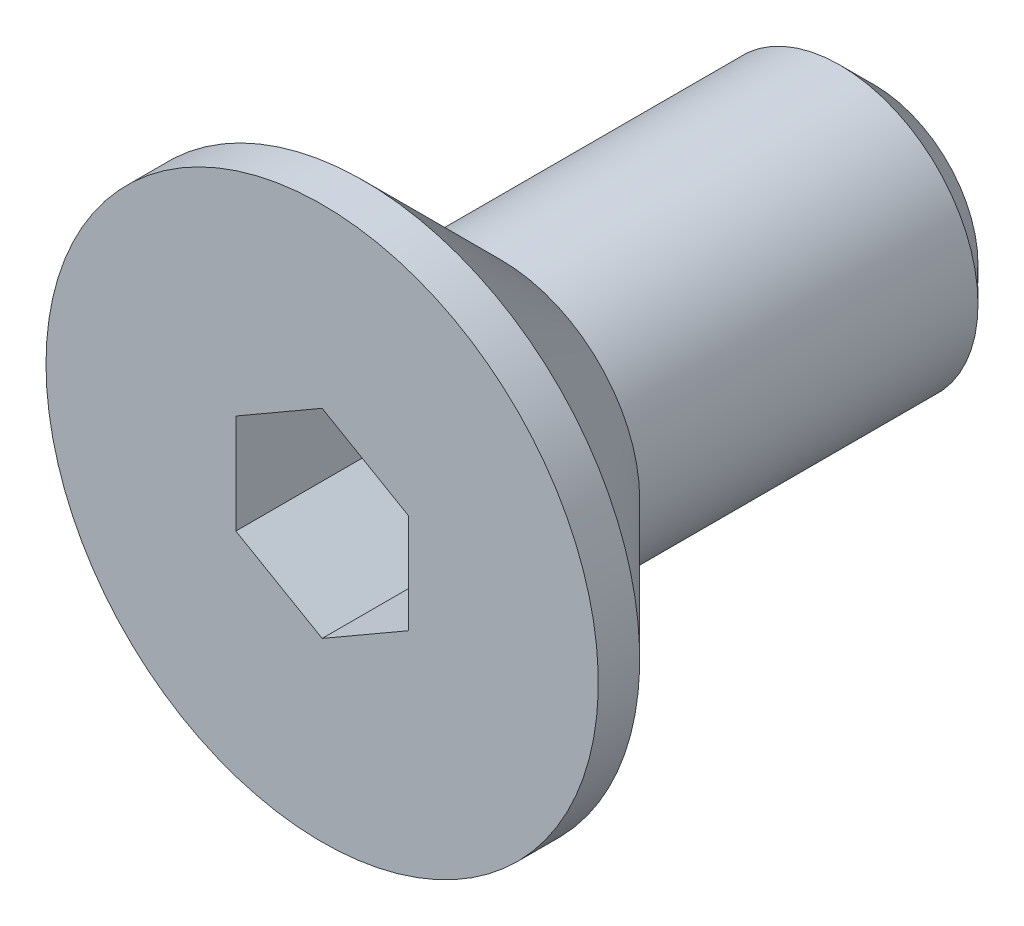
ISO-10303-21;
HEADER;
FILE_DESCRIPTION(('STEP AP214'),'2;1');
FILE_NAME('part.step','',(''),(''),'','','');
FILE_SCHEMA(('AUTOMOTIVE_DESIGN { 1 0 10303 214 1 1 1 1 }'));
ENDSEC;
DATA;
#1=APPLICATION_CONTEXT('core data for automotive mechanical design processes');
#2=APPLICATION_PROTOCOL_DEFINITION('international standard','automotive_design',2000,#1);
#3=PRODUCT_CONTEXT('',#1,'mechanical');
#4=PRODUCT('Part','Part','',(#3));
#5=PRODUCT_RELATED_PRODUCT_CATEGORY('part','',(#4));
#6=PRODUCT_DEFINITION_FORMATION('','',#4);
#7=PRODUCT_DEFINITION_CONTEXT('part definition',#1,'design');
#8=PRODUCT_DEFINITION('design','',#6,#7);
#9=PRODUCT_DEFINITION_SHAPE('','',#8);
#10=(LENGTH_UNIT() NAMED_UNIT(*) SI_UNIT(.MILLI.,.METRE.));
#11=(NAMED_UNIT(*) PLANE_ANGLE_UNIT() SI_UNIT($,.RADIAN.));
#12=(NAMED_UNIT(*) SI_UNIT($,.STERADIAN.) SOLID_ANGLE_UNIT());
#13=UNCERTAINTY_MEASURE_WITH_UNIT(LENGTH_MEASURE(1.E-05),#10,'distance_accuracy_value','');
#14=(GEOMETRIC_REPRESENTATION_CONTEXT(3) GLOBAL_UNCERTAINTY_ASSIGNED_CONTEXT((#13)) GLOBAL_UNIT_ASSIGNED_CONTEXT((#10,
#11,#12)) REPRESENTATION_CONTEXT('',''));
#15=CARTESIAN_POINT('',(0.,0.,0.));
#16=DIRECTION('',(0.,0.,1.));
#17=DIRECTION('',(1.,0.,0.));
#18=AXIS2_PLACEMENT_3D('',#15,#16,#17);
#19=CARTESIAN_POINT('',(0.,0.,4.));
#20=DIRECTION('',(0.,0.,1.));
#21=DIRECTION('',(1.,0.,0.));
#22=AXIS2_PLACEMENT_3D('',#19,#20,#21);
#23=PLANE('',#22);
#24=DIRECTION('',(-0.866025403784439,0.5,0.));
#25=VECTOR('',#24,1.);
#26=CARTESIAN_POINT('',(1.25,0.721687836487034,4.));
#27=LINE('',#26,#25);
#28=CARTESIAN_POINT('',(1.25,0.721687836487034,4.));
#29=VERTEX_POINT('',#28);
#30=CARTESIAN_POINT('',(0.,1.44337567297407,4.));
#31=VERTEX_POINT('',#30);
#32=EDGE_CURVE('E53',#29,#31,#27,.T.);
#33=ORIENTED_EDGE('',*,*,#32,.F.);
#34=DIRECTION('',(0.,1.,0.));
#35=VECTOR('',#34,1.);
#36=CARTESIAN_POINT('',(1.25,-0.721687836487031,4.));
#37=LINE('',#36,#35);
#38=CARTESIAN_POINT('',(1.25,-0.721687836487031,4.));
#39=VERTEX_POINT('',#38);
#40=EDGE_CURVE('E136',#39,#29,#37,.T.);
#41=ORIENTED_EDGE('',*,*,#40,.F.);
#42=DIRECTION('',(0.866025403784439,0.5,0.));
#43=VECTOR('',#42,1.);
#44=CARTESIAN_POINT('',(0.,-1.44337567297406,4.));
#45=LINE('',#44,#43);
#46=CARTESIAN_POINT('',(0.,-1.44337567297406,4.));
#47=VERTEX_POINT('',#46);
#48=EDGE_CURVE('E134',#47,#39,#45,.T.);
#49=ORIENTED_EDGE('',*,*,#48,.F.);
#50=DIRECTION('',(0.866025403784439,-0.5,0.));
#51=VECTOR('',#50,1.);
#52=CARTESIAN_POINT('',(-1.25,-0.721687836487031,4.));
#53=LINE('',#52,#51);
#54=CARTESIAN_POINT('',(-1.25,-0.721687836487031,4.));
#55=VERTEX_POINT('',#54);
#56=EDGE_CURVE('E101',#55,#47,#53,.T.);
#57=ORIENTED_EDGE('',*,*,#56,.F.);
#58=DIRECTION('',(0.,-1.,0.));
#59=VECTOR('',#58,1.);
#60=CARTESIAN_POINT('',(-1.25,0.721687836487034,4.));
#61=LINE('',#60,#59);
#62=CARTESIAN_POINT('',(-1.25,0.721687836487034,4.));
#63=VERTEX_POINT('',#62);
#64=EDGE_CURVE('E130',#63,#55,#61,.T.);
#65=ORIENTED_EDGE('',*,*,#64,.F.);
#66=DIRECTION('',(-0.866025403784439,-0.5,0.));
#67=VECTOR('',#66,1.);
#68=CARTESIAN_POINT('',(0.,1.44337567297407,4.));
#69=LINE('',#68,#67);
#70=EDGE_CURVE('E127',#31,#63,#69,.T.);
#71=ORIENTED_EDGE('',*,*,#70,.F.);
#72=EDGE_LOOP('',(#33,#41,#49,#57,#65,#71));
#73=FACE_BOUND('',#72,.T.);
#74=CARTESIAN_POINT('',(0.,0.,4.));
#75=DIRECTION('',(0.,0.,-1.));
#76=DIRECTION('',(-1.,0.,0.));
#77=AXIS2_PLACEMENT_3D('',#74,#75,#76);
#78=CIRCLE('',#77,4.);
#79=CARTESIAN_POINT('',(-4.,0.,4.));
#80=VERTEX_POINT('',#79);
#81=EDGE_CURVE('E151',#80,#80,#78,.T.);
#82=ORIENTED_EDGE('',*,*,#81,.F.);
#83=EDGE_LOOP('',(#82));
#84=FACE_BOUND('',#83,.T.);
#85=ADVANCED_FACE('F37',(#73,#84),#23,.T.);
#86=CARTESIAN_POINT('',(0.,0.,-4.));
#87=DIRECTION('',(0.,0.,-1.));
#88=DIRECTION('',(-1.,0.,0.));
#89=AXIS2_PLACEMENT_3D('',#86,#87,#88);
#90=CYLINDRICAL_SURFACE('',#89,4.);
#91=ORIENTED_EDGE('',*,*,#81,.T.);
#92=EDGE_LOOP('',(#91));
#93=FACE_BOUND('',#92,.T.);
#94=CARTESIAN_POINT('',(0.,0.,3.39999999999999));
#95=DIRECTION('',(0.,0.,-1.));
#96=DIRECTION('',(-1.,0.,0.));
#97=AXIS2_PLACEMENT_3D('',#94,#95,#96);
#98=CIRCLE('',#97,4.);
#99=CARTESIAN_POINT('',(-4.,0.,3.39999999999999));
#100=VERTEX_POINT('',#99);
#101=EDGE_CURVE('E148',#100,#100,#98,.T.);
#102=ORIENTED_EDGE('',*,*,#101,.F.);
#103=EDGE_LOOP('',(#102));
#104=FACE_BOUND('',#103,.T.);
#105=ADVANCED_FACE('F171',(#93,#104),#90,.T.);
#106=CARTESIAN_POINT('',(0.,0.,1.4));
#107=DIRECTION('',(0.,0.,1.));
#108=DIRECTION('',(1.,0.,0.));
#109=AXIS2_PLACEMENT_3D('',#106,#107,#108);
#110=CONICAL_SURFACE('',#109,2.,0.78539816339745);
#111=ORIENTED_EDGE('',*,*,#101,.T.);
#112=EDGE_LOOP('',(#111));
#113=FACE_BOUND('',#112,.T.);
#114=CARTESIAN_POINT('',(0.,0.,1.4));
#115=DIRECTION('',(0.,0.,-1.));
#116=DIRECTION('',(-1.,0.,0.));
#117=AXIS2_PLACEMENT_3D('',#114,#115,#116);
#118=CIRCLE('',#117,2.);
#119=CARTESIAN_POINT('',(-2.,0.,1.4));
#120=VERTEX_POINT('',#119);
#121=EDGE_CURVE('E140',#120,#120,#118,.T.);
#122=ORIENTED_EDGE('',*,*,#121,.F.);
#123=EDGE_LOOP('',(#122));
#124=FACE_BOUND('',#123,.T.);
#125=ADVANCED_FACE('F176',(#113,#124),#110,.T.);
#126=CARTESIAN_POINT('',(0.,0.,-4.));
#127=DIRECTION('',(0.,0.,-1.));
#128=DIRECTION('',(-1.,0.,0.));
#129=AXIS2_PLACEMENT_3D('',#126,#127,#128);
#130=CYLINDRICAL_SURFACE('',#129,2.);
#131=CARTESIAN_POINT('',(0.,0.,-3.5));
#132=DIRECTION('',(0.,0.,-1.));
#133=DIRECTION('',(-1.,0.,0.));
#134=AXIS2_PLACEMENT_3D('',#131,#132,#133);
#135=CIRCLE('',#134,2.);
#136=CARTESIAN_POINT('',(-2.,0.,-3.5));
#137=VERTEX_POINT('',#136);
#138=EDGE_CURVE('E11',#137,#137,#135,.F.);
#139=ORIENTED_EDGE('',*,*,#138,.T.);
#140=EDGE_LOOP('',(#139));
#141=FACE_BOUND('',#140,.T.);
#142=ORIENTED_EDGE('',*,*,#121,.T.);
#143=EDGE_LOOP('',(#142));
#144=FACE_BOUND('',#143,.T.);
#145=ADVANCED_FACE('F167',(#141,#144),#130,.T.);
#146=CARTESIAN_POINT('',(0.,2.,-4.));
#147=DIRECTION('',(0.,0.,-1.));
#148=DIRECTION('',(-1.,0.,0.));
#149=AXIS2_PLACEMENT_3D('',#146,#147,#148);
#150=PLANE('',#149);
#151=CARTESIAN_POINT('',(0.,0.,-4.));
#152=DIRECTION('',(0.,0.,-1.));
#153=DIRECTION('',(-1.,0.,0.));
#154=AXIS2_PLACEMENT_3D('',#151,#152,#153);
#155=CIRCLE('',#154,1.5);
#156=CARTESIAN_POINT('',(-1.5,0.,-4.));
#157=VERTEX_POINT('',#156);
#158=EDGE_CURVE('E46',#157,#157,#155,.T.);
#159=ORIENTED_EDGE('',*,*,#158,.T.);
#160=EDGE_LOOP('',(#159));
#161=FACE_BOUND('',#160,.T.);
#162=ADVANCED_FACE('F156',(#161),#150,.T.);
#163=CARTESIAN_POINT('',(0.,0.,-4.));
#164=DIRECTION('',(0.,0.,1.));
#165=DIRECTION('',(1.,0.,0.));
#166=AXIS2_PLACEMENT_3D('',#163,#164,#165);
#167=CONICAL_SURFACE('',#166,1.5,0.785398163397445);
#168=ORIENTED_EDGE('',*,*,#138,.F.);
#169=EDGE_LOOP('',(#168));
#170=FACE_BOUND('',#169,.T.);
#171=ORIENTED_EDGE('',*,*,#158,.F.);
#172=EDGE_LOOP('',(#171));
#173=FACE_BOUND('',#172,.T.);
#174=ADVANCED_FACE('F40',(#170,#173),#167,.T.);
#175=CARTESIAN_POINT('',(1.25,0.721687836487034,1.5));
#176=DIRECTION('',(0.5,0.866025403784439,0.));
#177=DIRECTION('',(-0.866025403784439,0.5,0.));
#178=AXIS2_PLACEMENT_3D('',#175,#176,#177);
#179=PLANE('',#178);
#180=ORIENTED_EDGE('',*,*,#32,.T.);
#181=DIRECTION('',(0.,0.,1.));
#182=VECTOR('',#181,1.);
#183=CARTESIAN_POINT('',(0.,1.44337567297407,1.5));
#184=LINE('',#183,#182);
#185=CARTESIAN_POINT('',(0.,1.44337567297407,1.5));
#186=VERTEX_POINT('',#185);
#187=EDGE_CURVE('E83',#186,#31,#184,.T.);
#188=ORIENTED_EDGE('',*,*,#187,.F.);
#189=DIRECTION('',(-0.866025403784439,0.5,0.));
#190=VECTOR('',#189,1.);
#191=CARTESIAN_POINT('',(1.25,0.721687836487034,1.5));
#192=LINE('',#191,#190);
#193=CARTESIAN_POINT('',(1.25,0.721687836487034,1.5));
#194=VERTEX_POINT('',#193);
#195=EDGE_CURVE('E138',#194,#186,#192,.T.);
#196=ORIENTED_EDGE('',*,*,#195,.F.);
#197=DIRECTION('',(0.,0.,1.));
#198=VECTOR('',#197,1.);
#199=CARTESIAN_POINT('',(1.25,0.721687836487034,1.5));
#200=LINE('',#199,#198);
#201=EDGE_CURVE('E61',#194,#29,#200,.T.);
#202=ORIENTED_EDGE('',*,*,#201,.T.);
#203=EDGE_LOOP('',(#180,#188,#196,#202));
#204=FACE_BOUND('',#203,.T.);
#205=ADVANCED_FACE('F159',(#204),#179,.F.);
#206=CARTESIAN_POINT('',(1.25,-0.721687836487031,1.5));
#207=DIRECTION('',(1.,0.,0.));
#208=DIRECTION('',(0.,1.,0.));
#209=AXIS2_PLACEMENT_3D('',#206,#207,#208);
#210=PLANE('',#209);
#211=ORIENTED_EDGE('',*,*,#40,.T.);
#212=ORIENTED_EDGE('',*,*,#201,.F.);
#213=DIRECTION('',(0.,1.,0.));
#214=VECTOR('',#213,1.);
#215=CARTESIAN_POINT('',(1.25,-0.721687836487031,1.5));
#216=LINE('',#215,#214);
#217=CARTESIAN_POINT('',(1.25,-0.721687836487031,1.5));
#218=VERTEX_POINT('',#217);
#219=EDGE_CURVE('E113',#218,#194,#216,.T.);
#220=ORIENTED_EDGE('',*,*,#219,.F.);
#221=DIRECTION('',(0.,0.,1.));
#222=VECTOR('',#221,1.);
#223=CARTESIAN_POINT('',(1.25,-0.721687836487031,1.5));
#224=LINE('',#223,#222);
#225=EDGE_CURVE('E105',#218,#39,#224,.T.);
#226=ORIENTED_EDGE('',*,*,#225,.T.);
#227=EDGE_LOOP('',(#211,#212,#220,#226));
#228=FACE_BOUND('',#227,.T.);
#229=ADVANCED_FACE('F165',(#228),#210,.F.);
#230=CARTESIAN_POINT('',(0.,-1.44337567297406,1.5));
#231=DIRECTION('',(0.5,-0.866025403784439,0.));
#232=DIRECTION('',(0.866025403784439,0.5,0.));
#233=AXIS2_PLACEMENT_3D('',#230,#231,#232);
#234=PLANE('',#233);
#235=ORIENTED_EDGE('',*,*,#48,.T.);
#236=ORIENTED_EDGE('',*,*,#225,.F.);
#237=DIRECTION('',(0.866025403784439,0.5,0.));
#238=VECTOR('',#237,1.);
#239=CARTESIAN_POINT('',(0.,-1.44337567297406,1.5));
#240=LINE('',#239,#238);
#241=CARTESIAN_POINT('',(0.,-1.44337567297406,1.5));
#242=VERTEX_POINT('',#241);
#243=EDGE_CURVE('E109',#242,#218,#240,.T.);
#244=ORIENTED_EDGE('',*,*,#243,.F.);
#245=DIRECTION('',(0.,0.,1.));
#246=VECTOR('',#245,1.);
#247=CARTESIAN_POINT('',(0.,-1.44337567297406,1.5));
#248=LINE('',#247,#246);
#249=EDGE_CURVE('E94',#242,#47,#248,.T.);
#250=ORIENTED_EDGE('',*,*,#249,.T.);
#251=EDGE_LOOP('',(#235,#236,#244,#250));
#252=FACE_BOUND('',#251,.T.);
#253=ADVANCED_FACE('F110',(#252),#234,.F.);
#254=CARTESIAN_POINT('',(-1.25,-0.721687836487031,1.5));
#255=DIRECTION('',(-0.5,-0.866025403784438,0.));
#256=DIRECTION('',(0.866025403784439,-0.5,0.));
#257=AXIS2_PLACEMENT_3D('',#254,#255,#256);
#258=PLANE('',#257);
#259=ORIENTED_EDGE('',*,*,#56,.T.);
#260=ORIENTED_EDGE('',*,*,#249,.F.);
#261=DIRECTION('',(0.866025403784439,-0.5,0.));
#262=VECTOR('',#261,1.);
#263=CARTESIAN_POINT('',(-1.25,-0.721687836487031,1.5));
#264=LINE('',#263,#262);
#265=CARTESIAN_POINT('',(-1.25,-0.721687836487031,1.5));
#266=VERTEX_POINT('',#265);
#267=EDGE_CURVE('E98',#266,#242,#264,.T.);
#268=ORIENTED_EDGE('',*,*,#267,.F.);
#269=DIRECTION('',(0.,0.,1.));
#270=VECTOR('',#269,1.);
#271=CARTESIAN_POINT('',(-1.25,-0.721687836487031,1.5));
#272=LINE('',#271,#270);
#273=EDGE_CURVE('E106',#266,#55,#272,.T.);
#274=ORIENTED_EDGE('',*,*,#273,.T.);
#275=EDGE_LOOP('',(#259,#260,#268,#274));
#276=FACE_BOUND('',#275,.T.);
#277=ADVANCED_FACE('F96',(#276),#258,.F.);
#278=CARTESIAN_POINT('',(-1.25,0.721687836487034,1.5));
#279=DIRECTION('',(-1.,0.,0.));
#280=DIRECTION('',(0.,0.,1.));
#281=AXIS2_PLACEMENT_3D('',#278,#279,#280);
#282=PLANE('',#281);
#283=ORIENTED_EDGE('',*,*,#64,.T.);
#284=ORIENTED_EDGE('',*,*,#273,.F.);
#285=DIRECTION('',(0.,-1.,0.));
#286=VECTOR('',#285,1.);
#287=CARTESIAN_POINT('',(-1.25,0.721687836487034,1.5));
#288=LINE('',#287,#286);
#289=CARTESIAN_POINT('',(-1.25,0.721687836487034,1.5));
#290=VERTEX_POINT('',#289);
#291=EDGE_CURVE('E119',#290,#266,#288,.T.);
#292=ORIENTED_EDGE('',*,*,#291,.F.);
#293=DIRECTION('',(0.,0.,1.));
#294=VECTOR('',#293,1.);
#295=CARTESIAN_POINT('',(-1.25,0.721687836487034,1.5));
#296=LINE('',#295,#294);
#297=EDGE_CURVE('E143',#290,#63,#296,.T.);
#298=ORIENTED_EDGE('',*,*,#297,.T.);
#299=EDGE_LOOP('',(#283,#284,#292,#298));
#300=FACE_BOUND('',#299,.T.);
#301=ADVANCED_FACE('F190',(#300),#282,.F.);
#302=CARTESIAN_POINT('',(0.,1.44337567297407,1.5));
#303=DIRECTION('',(-0.5,0.866025403784439,0.));
#304=DIRECTION('',(-0.866025403784439,-0.5,0.));
#305=AXIS2_PLACEMENT_3D('',#302,#303,#304);
#306=PLANE('',#305);
#307=ORIENTED_EDGE('',*,*,#70,.T.);
#308=ORIENTED_EDGE('',*,*,#297,.F.);
#309=DIRECTION('',(-0.866025403784439,-0.5,0.));
#310=VECTOR('',#309,1.);
#311=CARTESIAN_POINT('',(0.,1.44337567297407,1.5));
#312=LINE('',#311,#310);
#313=EDGE_CURVE('E121',#186,#290,#312,.T.);
#314=ORIENTED_EDGE('',*,*,#313,.F.);
#315=ORIENTED_EDGE('',*,*,#187,.T.);
#316=EDGE_LOOP('',(#307,#308,#314,#315));
#317=FACE_BOUND('',#316,.T.);
#318=ADVANCED_FACE('F187',(#317),#306,.F.);
#319=CARTESIAN_POINT('',(0.,0.,1.5));
#320=DIRECTION('',(0.,0.,1.));
#321=DIRECTION('',(1.,0.,0.));
#322=AXIS2_PLACEMENT_3D('',#319,#320,#321);
#323=PLANE('',#322);
#324=ORIENTED_EDGE('',*,*,#195,.T.);
#325=ORIENTED_EDGE('',*,*,#313,.T.);
#326=ORIENTED_EDGE('',*,*,#291,.T.);
#327=ORIENTED_EDGE('',*,*,#267,.T.);
#328=ORIENTED_EDGE('',*,*,#243,.T.);
#329=ORIENTED_EDGE('',*,*,#219,.T.);
#330=EDGE_LOOP('',(#324,#325,#326,#327,#328,#329));
#331=FACE_BOUND('',#330,.T.);
#332=ADVANCED_FACE('F116',(#331),#323,.T.);
#333=CLOSED_SHELL('',(#85,#105,#125,#145,#162,#174,#205,#229,#253,#277,#301,#318,#332));
#334=MANIFOLD_SOLID_BREP('B2',#333);
#335=ADVANCED_BREP_SHAPE_REPRESENTATION('',(#18,#334),#14);
#336=SHAPE_DEFINITION_REPRESENTATION(#9,#335);
ENDSEC;
END-ISO-10303-21;
